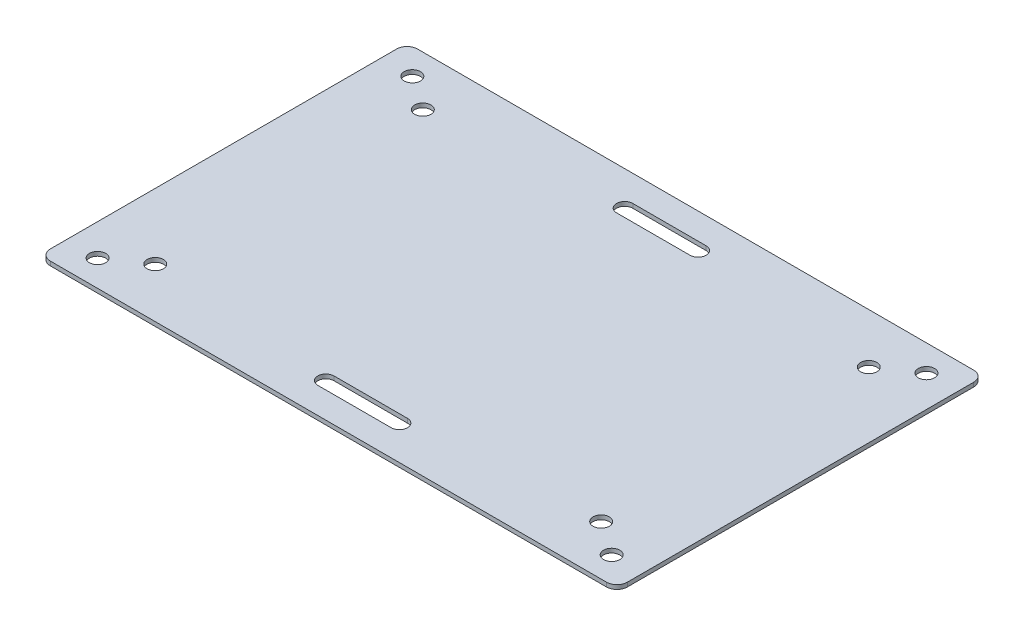
ISO-10303-21;
HEADER;
FILE_DESCRIPTION(('STEP AP214'),'2;1');
FILE_NAME('part.step','',(''),(''),'','','');
FILE_SCHEMA(('AUTOMOTIVE_DESIGN { 1 0 10303 214 1 1 1 1 }'));
ENDSEC;
DATA;
#1=APPLICATION_CONTEXT('core data for automotive mechanical design processes');
#2=APPLICATION_PROTOCOL_DEFINITION('international standard','automotive_design',2000,#1);
#3=PRODUCT_CONTEXT('',#1,'mechanical');
#4=PRODUCT('Part','Part','',(#3));
#5=PRODUCT_RELATED_PRODUCT_CATEGORY('part','',(#4));
#6=PRODUCT_DEFINITION_FORMATION('','',#4);
#7=PRODUCT_DEFINITION_CONTEXT('part definition',#1,'design');
#8=PRODUCT_DEFINITION('design','',#6,#7);
#9=PRODUCT_DEFINITION_SHAPE('','',#8);
#10=(LENGTH_UNIT() NAMED_UNIT(*) SI_UNIT(.MILLI.,.METRE.));
#11=(NAMED_UNIT(*) PLANE_ANGLE_UNIT() SI_UNIT($,.RADIAN.));
#12=(NAMED_UNIT(*) SI_UNIT($,.STERADIAN.) SOLID_ANGLE_UNIT());
#13=UNCERTAINTY_MEASURE_WITH_UNIT(LENGTH_MEASURE(1.E-05),#10,'distance_accuracy_value','');
#14=(GEOMETRIC_REPRESENTATION_CONTEXT(3) GLOBAL_UNCERTAINTY_ASSIGNED_CONTEXT((#13)) GLOBAL_UNIT_ASSIGNED_CONTEXT((#10,
#11,#12)) REPRESENTATION_CONTEXT('',''));
#15=CARTESIAN_POINT('',(0.,0.,0.));
#16=DIRECTION('',(0.,0.,1.));
#17=DIRECTION('',(1.,0.,0.));
#18=AXIS2_PLACEMENT_3D('',#15,#16,#17);
#19=CARTESIAN_POINT('',(0.,0.8,0.));
#20=DIRECTION('',(0.,1.,0.));
#21=DIRECTION('',(0.,0.,1.));
#22=AXIS2_PLACEMENT_3D('',#19,#20,#21);
#23=PLANE('',#22);
#24=CARTESIAN_POINT('',(42.5,0.8,25.5));
#25=DIRECTION('',(0.,1.,0.));
#26=DIRECTION('',(0.,0.,1.));
#27=AXIS2_PLACEMENT_3D('',#24,#25,#26);
#28=CIRCLE('',#27,1.55);
#29=CARTESIAN_POINT('',(42.5,0.8,27.05));
#30=VERTEX_POINT('',#29);
#31=EDGE_CURVE('E258',#30,#30,#28,.T.);
#32=ORIENTED_EDGE('',*,*,#31,.F.);
#33=EDGE_LOOP('',(#32));
#34=FACE_BOUND('',#33,.T.);
#35=CARTESIAN_POINT('',(-42.5,0.8,-25.5));
#36=DIRECTION('',(0.,1.,0.));
#37=DIRECTION('',(0.,0.,1.));
#38=AXIS2_PLACEMENT_3D('',#35,#36,#37);
#39=CIRCLE('',#38,1.55);
#40=CARTESIAN_POINT('',(-42.5,0.8,-23.95));
#41=VERTEX_POINT('',#40);
#42=EDGE_CURVE('E274',#41,#41,#39,.T.);
#43=ORIENTED_EDGE('',*,*,#42,.F.);
#44=EDGE_LOOP('',(#43));
#45=FACE_BOUND('',#44,.T.);
#46=CARTESIAN_POINT('',(49.,0.8,30.));
#47=DIRECTION('',(0.,1.,0.));
#48=DIRECTION('',(0.,0.,1.));
#49=AXIS2_PLACEMENT_3D('',#46,#47,#48);
#50=CIRCLE('',#49,1.55);
#51=CARTESIAN_POINT('',(49.,0.8,31.55));
#52=VERTEX_POINT('',#51);
#53=EDGE_CURVE('E290',#52,#52,#50,.T.);
#54=ORIENTED_EDGE('',*,*,#53,.F.);
#55=EDGE_LOOP('',(#54));
#56=FACE_BOUND('',#55,.T.);
#57=CARTESIAN_POINT('',(-49.,0.8,-30.));
#58=DIRECTION('',(0.,1.,0.));
#59=DIRECTION('',(0.,0.,1.));
#60=AXIS2_PLACEMENT_3D('',#57,#58,#59);
#61=CIRCLE('',#60,1.55);
#62=CARTESIAN_POINT('',(-49.,0.8,-28.45));
#63=VERTEX_POINT('',#62);
#64=EDGE_CURVE('E306',#63,#63,#61,.T.);
#65=ORIENTED_EDGE('',*,*,#64,.F.);
#66=EDGE_LOOP('',(#65));
#67=FACE_BOUND('',#66,.T.);
#68=DIRECTION('',(1.,0.,0.));
#69=VECTOR('',#68,1.);
#70=CARTESIAN_POINT('',(-55.,0.8,35.));
#71=LINE('',#70,#69);
#72=CARTESIAN_POINT('',(-53.,0.8,35.));
#73=VERTEX_POINT('',#72);
#74=CARTESIAN_POINT('',(53.,0.8,35.));
#75=VERTEX_POINT('',#74);
#76=EDGE_CURVE('E326',#73,#75,#71,.T.);
#77=ORIENTED_EDGE('',*,*,#76,.T.);
#78=CARTESIAN_POINT('',(53.,0.8,33.));
#79=DIRECTION('',(0.,1.,0.));
#80=DIRECTION('',(0.,0.,1.));
#81=AXIS2_PLACEMENT_3D('',#78,#79,#80);
#82=CIRCLE('',#81,2.);
#83=CARTESIAN_POINT('',(55.,0.8,33.));
#84=VERTEX_POINT('',#83);
#85=EDGE_CURVE('E11',#75,#84,#82,.T.);
#86=ORIENTED_EDGE('',*,*,#85,.T.);
#87=DIRECTION('',(0.,0.,-1.));
#88=VECTOR('',#87,1.);
#89=CARTESIAN_POINT('',(55.,0.8,-35.));
#90=LINE('',#89,#88);
#91=CARTESIAN_POINT('',(55.,0.8,-33.));
#92=VERTEX_POINT('',#91);
#93=EDGE_CURVE('E314',#84,#92,#90,.T.);
#94=ORIENTED_EDGE('',*,*,#93,.T.);
#95=CARTESIAN_POINT('',(53.,0.8,-33.));
#96=DIRECTION('',(0.,1.,0.));
#97=DIRECTION('',(0.,0.,1.));
#98=AXIS2_PLACEMENT_3D('',#95,#96,#97);
#99=CIRCLE('',#98,2.);
#100=CARTESIAN_POINT('',(53.,0.8,-35.));
#101=VERTEX_POINT('',#100);
#102=EDGE_CURVE('E353',#92,#101,#99,.T.);
#103=ORIENTED_EDGE('',*,*,#102,.T.);
#104=DIRECTION('',(-1.,0.,0.));
#105=VECTOR('',#104,1.);
#106=CARTESIAN_POINT('',(-55.,0.8,-35.));
#107=LINE('',#106,#105);
#108=CARTESIAN_POINT('',(-53.,0.8,-35.));
#109=VERTEX_POINT('',#108);
#110=EDGE_CURVE('E317',#101,#109,#107,.T.);
#111=ORIENTED_EDGE('',*,*,#110,.T.);
#112=CARTESIAN_POINT('',(-53.,0.8,-33.));
#113=DIRECTION('',(0.,1.,0.));
#114=DIRECTION('',(0.,0.,1.));
#115=AXIS2_PLACEMENT_3D('',#112,#113,#114);
#116=CIRCLE('',#115,2.);
#117=CARTESIAN_POINT('',(-55.,0.8,-33.));
#118=VERTEX_POINT('',#117);
#119=EDGE_CURVE('E366',#109,#118,#116,.T.);
#120=ORIENTED_EDGE('',*,*,#119,.T.);
#121=DIRECTION('',(0.,0.,1.));
#122=VECTOR('',#121,1.);
#123=CARTESIAN_POINT('',(-55.,0.8,-35.));
#124=LINE('',#123,#122);
#125=CARTESIAN_POINT('',(-55.,0.8,33.));
#126=VERTEX_POINT('',#125);
#127=EDGE_CURVE('E322',#118,#126,#124,.T.);
#128=ORIENTED_EDGE('',*,*,#127,.T.);
#129=CARTESIAN_POINT('',(-53.,0.8,33.));
#130=DIRECTION('',(0.,1.,0.));
#131=DIRECTION('',(0.,0.,1.));
#132=AXIS2_PLACEMENT_3D('',#129,#130,#131);
#133=CIRCLE('',#132,2.);
#134=EDGE_CURVE('E379',#126,#73,#133,.T.);
#135=ORIENTED_EDGE('',*,*,#134,.T.);
#136=EDGE_LOOP('',(#77,#86,#94,#103,#111,#120,#128,#135));
#137=FACE_BOUND('',#136,.T.);
#138=CARTESIAN_POINT('',(49.,0.8,-30.));
#139=DIRECTION('',(0.,1.,0.));
#140=DIRECTION('',(0.,0.,-1.));
#141=AXIS2_PLACEMENT_3D('',#138,#139,#140);
#142=CIRCLE('',#141,1.55);
#143=CARTESIAN_POINT('',(49.,0.8,-31.55));
#144=VERTEX_POINT('',#143);
#145=EDGE_CURVE('E298',#144,#144,#142,.T.);
#146=ORIENTED_EDGE('',*,*,#145,.F.);
#147=EDGE_LOOP('',(#146));
#148=FACE_BOUND('',#147,.T.);
#149=CARTESIAN_POINT('',(-49.,0.8,30.));
#150=DIRECTION('',(0.,1.,0.));
#151=DIRECTION('',(0.,0.,-1.));
#152=AXIS2_PLACEMENT_3D('',#149,#150,#151);
#153=CIRCLE('',#152,1.55);
#154=CARTESIAN_POINT('',(-49.,0.8,28.45));
#155=VERTEX_POINT('',#154);
#156=EDGE_CURVE('E282',#155,#155,#153,.T.);
#157=ORIENTED_EDGE('',*,*,#156,.F.);
#158=EDGE_LOOP('',(#157));
#159=FACE_BOUND('',#158,.T.);
#160=CARTESIAN_POINT('',(42.5,0.8,-25.5));
#161=DIRECTION('',(0.,1.,0.));
#162=DIRECTION('',(0.,0.,-1.));
#163=AXIS2_PLACEMENT_3D('',#160,#161,#162);
#164=CIRCLE('',#163,1.55);
#165=CARTESIAN_POINT('',(42.5,0.8,-27.05));
#166=VERTEX_POINT('',#165);
#167=EDGE_CURVE('E266',#166,#166,#164,.T.);
#168=ORIENTED_EDGE('',*,*,#167,.F.);
#169=EDGE_LOOP('',(#168));
#170=FACE_BOUND('',#169,.T.);
#171=CARTESIAN_POINT('',(-42.5,0.8,25.5));
#172=DIRECTION('',(0.,1.,0.));
#173=DIRECTION('',(0.,0.,-1.));
#174=AXIS2_PLACEMENT_3D('',#171,#172,#173);
#175=CIRCLE('',#174,1.55);
#176=CARTESIAN_POINT('',(-42.5,0.8,23.95));
#177=VERTEX_POINT('',#176);
#178=EDGE_CURVE('E250',#177,#177,#175,.T.);
#179=ORIENTED_EDGE('',*,*,#178,.F.);
#180=EDGE_LOOP('',(#179));
#181=FACE_BOUND('',#180,.T.);
#182=DIRECTION('',(1.,0.,0.));
#183=VECTOR('',#182,1.);
#184=CARTESIAN_POINT('',(7.,0.8,-26.9233502741413));
#185=LINE('',#184,#183);
#186=CARTESIAN_POINT('',(-7.,0.8,-26.9233502741413));
#187=VERTEX_POINT('',#186);
#188=CARTESIAN_POINT('',(7.,0.8,-26.9233502741413));
#189=VERTEX_POINT('',#188);
#190=EDGE_CURVE('E210',#187,#189,#185,.T.);
#191=ORIENTED_EDGE('',*,*,#190,.F.);
#192=CARTESIAN_POINT('',(-7.,0.8,-28.4733502741413));
#193=DIRECTION('',(0.,1.,0.));
#194=DIRECTION('',(0.,0.,-1.));
#195=AXIS2_PLACEMENT_3D('',#192,#193,#194);
#196=CIRCLE('',#195,1.55);
#197=CARTESIAN_POINT('',(-7.,0.8,-30.0233502741413));
#198=VERTEX_POINT('',#197);
#199=EDGE_CURVE('E207',#198,#187,#196,.T.);
#200=ORIENTED_EDGE('',*,*,#199,.F.);
#201=DIRECTION('',(-1.,0.,0.));
#202=VECTOR('',#201,1.);
#203=CARTESIAN_POINT('',(-7.,0.8,-30.0233502741413));
#204=LINE('',#203,#202);
#205=CARTESIAN_POINT('',(7.,0.8,-30.0233502741413));
#206=VERTEX_POINT('',#205);
#207=EDGE_CURVE('E218',#206,#198,#204,.T.);
#208=ORIENTED_EDGE('',*,*,#207,.F.);
#209=CARTESIAN_POINT('',(7.,0.8,-28.4733502741413));
#210=DIRECTION('',(0.,1.,0.));
#211=DIRECTION('',(0.,0.,1.));
#212=AXIS2_PLACEMENT_3D('',#209,#210,#211);
#213=CIRCLE('',#212,1.55);
#214=EDGE_CURVE('E214',#189,#206,#213,.T.);
#215=ORIENTED_EDGE('',*,*,#214,.F.);
#216=EDGE_LOOP('',(#191,#200,#208,#215));
#217=FACE_BOUND('',#216,.T.);
#218=DIRECTION('',(-1.,0.,0.));
#219=VECTOR('',#218,1.);
#220=CARTESIAN_POINT('',(7.,0.8,26.9233502741413));
#221=LINE('',#220,#219);
#222=CARTESIAN_POINT('',(7.,0.8,26.9233502741413));
#223=VERTEX_POINT('',#222);
#224=CARTESIAN_POINT('',(-7.,0.8,26.9233502741413));
#225=VERTEX_POINT('',#224);
#226=EDGE_CURVE('E165',#223,#225,#221,.T.);
#227=ORIENTED_EDGE('',*,*,#226,.F.);
#228=CARTESIAN_POINT('',(7.,0.8,28.4733502741413));
#229=DIRECTION('',(0.,1.,0.));
#230=DIRECTION('',(0.,0.,-1.));
#231=AXIS2_PLACEMENT_3D('',#228,#229,#230);
#232=CIRCLE('',#231,1.55);
#233=CARTESIAN_POINT('',(7.,0.8,30.0233502741413));
#234=VERTEX_POINT('',#233);
#235=EDGE_CURVE('E154',#234,#223,#232,.T.);
#236=ORIENTED_EDGE('',*,*,#235,.F.);
#237=DIRECTION('',(1.,0.,0.));
#238=VECTOR('',#237,1.);
#239=CARTESIAN_POINT('',(-7.,0.8,30.0233502741413));
#240=LINE('',#239,#238);
#241=CARTESIAN_POINT('',(-7.,0.8,30.0233502741413));
#242=VERTEX_POINT('',#241);
#243=EDGE_CURVE('E183',#242,#234,#240,.T.);
#244=ORIENTED_EDGE('',*,*,#243,.F.);
#245=CARTESIAN_POINT('',(-7.,0.8,28.4733502741413));
#246=DIRECTION('',(0.,1.,0.));
#247=DIRECTION('',(0.,0.,1.));
#248=AXIS2_PLACEMENT_3D('',#245,#246,#247);
#249=CIRCLE('',#248,1.55);
#250=EDGE_CURVE('E179',#225,#242,#249,.T.);
#251=ORIENTED_EDGE('',*,*,#250,.F.);
#252=EDGE_LOOP('',(#227,#236,#244,#251));
#253=FACE_BOUND('',#252,.T.);
#254=ADVANCED_FACE('F39',(#34,#45,#56,#67,#137,#148,#159,#170,#181,#217,#253),#23,.T.);
#255=CARTESIAN_POINT('',(0.,0.,0.));
#256=DIRECTION('',(0.,1.,0.));
#257=DIRECTION('',(0.,0.,1.));
#258=AXIS2_PLACEMENT_3D('',#255,#256,#257);
#259=PLANE('',#258);
#260=CARTESIAN_POINT('',(-7.,0.,-28.4733502741413));
#261=DIRECTION('',(0.,1.,0.));
#262=DIRECTION('',(0.,0.,-1.));
#263=AXIS2_PLACEMENT_3D('',#260,#261,#262);
#264=CIRCLE('',#263,1.55);
#265=CARTESIAN_POINT('',(-7.,0.,-30.0233502741413));
#266=VERTEX_POINT('',#265);
#267=CARTESIAN_POINT('',(-7.,0.,-26.9233502741413));
#268=VERTEX_POINT('',#267);
#269=EDGE_CURVE('E174',#266,#268,#264,.T.);
#270=ORIENTED_EDGE('',*,*,#269,.T.);
#271=DIRECTION('',(1.,0.,0.));
#272=VECTOR('',#271,1.);
#273=CARTESIAN_POINT('',(7.,0.,-26.9233502741413));
#274=LINE('',#273,#272);
#275=CARTESIAN_POINT('',(7.,0.,-26.9233502741413));
#276=VERTEX_POINT('',#275);
#277=EDGE_CURVE('E225',#268,#276,#274,.T.);
#278=ORIENTED_EDGE('',*,*,#277,.T.);
#279=CARTESIAN_POINT('',(7.,0.,-28.4733502741413));
#280=DIRECTION('',(0.,1.,0.));
#281=DIRECTION('',(0.,0.,1.));
#282=AXIS2_PLACEMENT_3D('',#279,#280,#281);
#283=CIRCLE('',#282,1.55);
#284=CARTESIAN_POINT('',(7.,0.,-30.0233502741413));
#285=VERTEX_POINT('',#284);
#286=EDGE_CURVE('E229',#276,#285,#283,.T.);
#287=ORIENTED_EDGE('',*,*,#286,.T.);
#288=DIRECTION('',(-1.,0.,0.));
#289=VECTOR('',#288,1.);
#290=CARTESIAN_POINT('',(-7.,0.,-30.0233502741413));
#291=LINE('',#290,#289);
#292=EDGE_CURVE('E211',#285,#266,#291,.T.);
#293=ORIENTED_EDGE('',*,*,#292,.T.);
#294=EDGE_LOOP('',(#270,#278,#287,#293));
#295=FACE_BOUND('',#294,.T.);
#296=DIRECTION('',(0.,0.,-1.));
#297=VECTOR('',#296,1.);
#298=CARTESIAN_POINT('',(55.,0.,-35.));
#299=LINE('',#298,#297);
#300=CARTESIAN_POINT('',(55.,0.,33.));
#301=VERTEX_POINT('',#300);
#302=CARTESIAN_POINT('',(55.,0.,-33.));
#303=VERTEX_POINT('',#302);
#304=EDGE_CURVE('E310',#301,#303,#299,.T.);
#305=ORIENTED_EDGE('',*,*,#304,.F.);
#306=CARTESIAN_POINT('',(53.,0.,33.));
#307=DIRECTION('',(0.,1.,0.));
#308=DIRECTION('',(0.,0.,1.));
#309=AXIS2_PLACEMENT_3D('',#306,#307,#308);
#310=CIRCLE('',#309,2.);
#311=CARTESIAN_POINT('',(53.,0.,35.));
#312=VERTEX_POINT('',#311);
#313=EDGE_CURVE('E62',#301,#312,#310,.F.);
#314=ORIENTED_EDGE('',*,*,#313,.T.);
#315=DIRECTION('',(1.,0.,0.));
#316=VECTOR('',#315,1.);
#317=CARTESIAN_POINT('',(-55.,0.,35.));
#318=LINE('',#317,#316);
#319=CARTESIAN_POINT('',(-53.,0.,35.));
#320=VERTEX_POINT('',#319);
#321=EDGE_CURVE('E318',#320,#312,#318,.T.);
#322=ORIENTED_EDGE('',*,*,#321,.F.);
#323=CARTESIAN_POINT('',(-53.,0.,33.));
#324=DIRECTION('',(0.,1.,0.));
#325=DIRECTION('',(0.,0.,1.));
#326=AXIS2_PLACEMENT_3D('',#323,#324,#325);
#327=CIRCLE('',#326,2.);
#328=CARTESIAN_POINT('',(-55.,0.,33.));
#329=VERTEX_POINT('',#328);
#330=EDGE_CURVE('E373',#320,#329,#327,.F.);
#331=ORIENTED_EDGE('',*,*,#330,.T.);
#332=DIRECTION('',(0.,0.,1.));
#333=VECTOR('',#332,1.);
#334=CARTESIAN_POINT('',(-55.,0.,-35.));
#335=LINE('',#334,#333);
#336=CARTESIAN_POINT('',(-55.,0.,-33.));
#337=VERTEX_POINT('',#336);
#338=EDGE_CURVE('E336',#337,#329,#335,.T.);
#339=ORIENTED_EDGE('',*,*,#338,.F.);
#340=CARTESIAN_POINT('',(-53.,0.,-33.));
#341=DIRECTION('',(0.,1.,0.));
#342=DIRECTION('',(0.,0.,1.));
#343=AXIS2_PLACEMENT_3D('',#340,#341,#342);
#344=CIRCLE('',#343,2.);
#345=CARTESIAN_POINT('',(-53.,0.,-35.));
#346=VERTEX_POINT('',#345);
#347=EDGE_CURVE('E360',#337,#346,#344,.F.);
#348=ORIENTED_EDGE('',*,*,#347,.T.);
#349=DIRECTION('',(-1.,0.,0.));
#350=VECTOR('',#349,1.);
#351=CARTESIAN_POINT('',(-55.,0.,-35.));
#352=LINE('',#351,#350);
#353=CARTESIAN_POINT('',(53.,0.,-35.));
#354=VERTEX_POINT('',#353);
#355=EDGE_CURVE('E332',#354,#346,#352,.T.);
#356=ORIENTED_EDGE('',*,*,#355,.F.);
#357=CARTESIAN_POINT('',(53.,0.,-33.));
#358=DIRECTION('',(0.,1.,0.));
#359=DIRECTION('',(0.,0.,1.));
#360=AXIS2_PLACEMENT_3D('',#357,#358,#359);
#361=CIRCLE('',#360,2.);
#362=EDGE_CURVE('E345',#354,#303,#361,.F.);
#363=ORIENTED_EDGE('',*,*,#362,.T.);
#364=EDGE_LOOP('',(#305,#314,#322,#331,#339,#348,#356,#363));
#365=FACE_BOUND('',#364,.T.);
#366=CARTESIAN_POINT('',(-49.,0.,-30.));
#367=DIRECTION('',(0.,1.,0.));
#368=DIRECTION('',(0.,0.,1.));
#369=AXIS2_PLACEMENT_3D('',#366,#367,#368);
#370=CIRCLE('',#369,1.55);
#371=CARTESIAN_POINT('',(-49.,0.,-28.45));
#372=VERTEX_POINT('',#371);
#373=EDGE_CURVE('E302',#372,#372,#370,.T.);
#374=ORIENTED_EDGE('',*,*,#373,.T.);
#375=EDGE_LOOP('',(#374));
#376=FACE_BOUND('',#375,.T.);
#377=CARTESIAN_POINT('',(49.,0.,-30.));
#378=DIRECTION('',(0.,1.,0.));
#379=DIRECTION('',(0.,0.,-1.));
#380=AXIS2_PLACEMENT_3D('',#377,#378,#379);
#381=CIRCLE('',#380,1.55);
#382=CARTESIAN_POINT('',(49.,0.,-31.55));
#383=VERTEX_POINT('',#382);
#384=EDGE_CURVE('E294',#383,#383,#381,.T.);
#385=ORIENTED_EDGE('',*,*,#384,.T.);
#386=EDGE_LOOP('',(#385));
#387=FACE_BOUND('',#386,.T.);
#388=CARTESIAN_POINT('',(49.,0.,30.));
#389=DIRECTION('',(0.,1.,0.));
#390=DIRECTION('',(0.,0.,1.));
#391=AXIS2_PLACEMENT_3D('',#388,#389,#390);
#392=CIRCLE('',#391,1.55);
#393=CARTESIAN_POINT('',(49.,0.,31.55));
#394=VERTEX_POINT('',#393);
#395=EDGE_CURVE('E286',#394,#394,#392,.T.);
#396=ORIENTED_EDGE('',*,*,#395,.T.);
#397=EDGE_LOOP('',(#396));
#398=FACE_BOUND('',#397,.T.);
#399=CARTESIAN_POINT('',(-49.,0.,30.));
#400=DIRECTION('',(0.,1.,0.));
#401=DIRECTION('',(0.,0.,-1.));
#402=AXIS2_PLACEMENT_3D('',#399,#400,#401);
#403=CIRCLE('',#402,1.55);
#404=CARTESIAN_POINT('',(-49.,0.,28.45));
#405=VERTEX_POINT('',#404);
#406=EDGE_CURVE('E278',#405,#405,#403,.T.);
#407=ORIENTED_EDGE('',*,*,#406,.T.);
#408=EDGE_LOOP('',(#407));
#409=FACE_BOUND('',#408,.T.);
#410=CARTESIAN_POINT('',(-42.5,0.,-25.5));
#411=DIRECTION('',(0.,1.,0.));
#412=DIRECTION('',(0.,0.,1.));
#413=AXIS2_PLACEMENT_3D('',#410,#411,#412);
#414=CIRCLE('',#413,1.55);
#415=CARTESIAN_POINT('',(-42.5,0.,-23.95));
#416=VERTEX_POINT('',#415);
#417=EDGE_CURVE('E270',#416,#416,#414,.T.);
#418=ORIENTED_EDGE('',*,*,#417,.T.);
#419=EDGE_LOOP('',(#418));
#420=FACE_BOUND('',#419,.T.);
#421=CARTESIAN_POINT('',(42.5,0.,-25.5));
#422=DIRECTION('',(0.,1.,0.));
#423=DIRECTION('',(0.,0.,-1.));
#424=AXIS2_PLACEMENT_3D('',#421,#422,#423);
#425=CIRCLE('',#424,1.55);
#426=CARTESIAN_POINT('',(42.5,0.,-27.05));
#427=VERTEX_POINT('',#426);
#428=EDGE_CURVE('E262',#427,#427,#425,.T.);
#429=ORIENTED_EDGE('',*,*,#428,.T.);
#430=EDGE_LOOP('',(#429));
#431=FACE_BOUND('',#430,.T.);
#432=CARTESIAN_POINT('',(42.5,0.,25.5));
#433=DIRECTION('',(0.,1.,0.));
#434=DIRECTION('',(0.,0.,1.));
#435=AXIS2_PLACEMENT_3D('',#432,#433,#434);
#436=CIRCLE('',#435,1.55);
#437=CARTESIAN_POINT('',(42.5,0.,27.05));
#438=VERTEX_POINT('',#437);
#439=EDGE_CURVE('E254',#438,#438,#436,.T.);
#440=ORIENTED_EDGE('',*,*,#439,.T.);
#441=EDGE_LOOP('',(#440));
#442=FACE_BOUND('',#441,.T.);
#443=CARTESIAN_POINT('',(-42.5,0.,25.5));
#444=DIRECTION('',(0.,1.,0.));
#445=DIRECTION('',(0.,0.,-1.));
#446=AXIS2_PLACEMENT_3D('',#443,#444,#445);
#447=CIRCLE('',#446,1.55);
#448=CARTESIAN_POINT('',(-42.5,0.,23.95));
#449=VERTEX_POINT('',#448);
#450=EDGE_CURVE('E249',#449,#449,#447,.T.);
#451=ORIENTED_EDGE('',*,*,#450,.T.);
#452=EDGE_LOOP('',(#451));
#453=FACE_BOUND('',#452,.T.);
#454=CARTESIAN_POINT('',(7.,0.,28.4733502741413));
#455=DIRECTION('',(0.,1.,0.));
#456=DIRECTION('',(0.,0.,-1.));
#457=AXIS2_PLACEMENT_3D('',#454,#455,#456);
#458=CIRCLE('',#457,1.55);
#459=CARTESIAN_POINT('',(7.,0.,30.0233502741413));
#460=VERTEX_POINT('',#459);
#461=CARTESIAN_POINT('',(7.,0.,26.9233502741413));
#462=VERTEX_POINT('',#461);
#463=EDGE_CURVE('E188',#460,#462,#458,.T.);
#464=ORIENTED_EDGE('',*,*,#463,.T.);
#465=DIRECTION('',(-1.,0.,0.));
#466=VECTOR('',#465,1.);
#467=CARTESIAN_POINT('',(7.,0.,26.9233502741413));
#468=LINE('',#467,#466);
#469=CARTESIAN_POINT('',(-7.,0.,26.9233502741413));
#470=VERTEX_POINT('',#469);
#471=EDGE_CURVE('E172',#462,#470,#468,.T.);
#472=ORIENTED_EDGE('',*,*,#471,.T.);
#473=CARTESIAN_POINT('',(-7.,0.,28.4733502741413));
#474=DIRECTION('',(0.,1.,0.));
#475=DIRECTION('',(0.,0.,1.));
#476=AXIS2_PLACEMENT_3D('',#473,#474,#475);
#477=CIRCLE('',#476,1.55);
#478=CARTESIAN_POINT('',(-7.,0.,30.0233502741413));
#479=VERTEX_POINT('',#478);
#480=EDGE_CURVE('E193',#470,#479,#477,.T.);
#481=ORIENTED_EDGE('',*,*,#480,.T.);
#482=DIRECTION('',(1.,0.,0.));
#483=VECTOR('',#482,1.);
#484=CARTESIAN_POINT('',(-7.,0.,30.0233502741413));
#485=LINE('',#484,#483);
#486=EDGE_CURVE('E166',#479,#460,#485,.T.);
#487=ORIENTED_EDGE('',*,*,#486,.T.);
#488=EDGE_LOOP('',(#464,#472,#481,#487));
#489=FACE_BOUND('',#488,.T.);
#490=ADVANCED_FACE('F394',(#295,#365,#376,#387,#398,#409,#420,#431,#442,#453,#489),#259,.F.);
#491=CARTESIAN_POINT('',(55.,0.8,-35.));
#492=DIRECTION('',(-1.,0.,0.));
#493=DIRECTION('',(0.,0.,1.));
#494=AXIS2_PLACEMENT_3D('',#491,#492,#493);
#495=PLANE('',#494);
#496=ORIENTED_EDGE('',*,*,#93,.F.);
#497=DIRECTION('',(0.,-1.,0.));
#498=VECTOR('',#497,1.);
#499=CARTESIAN_POINT('',(55.,0.8,33.));
#500=LINE('',#499,#498);
#501=EDGE_CURVE('E382',#84,#301,#500,.T.);
#502=ORIENTED_EDGE('',*,*,#501,.T.);
#503=ORIENTED_EDGE('',*,*,#304,.T.);
#504=DIRECTION('',(0.,-1.,0.));
#505=VECTOR('',#504,1.);
#506=CARTESIAN_POINT('',(55.,0.8,-33.));
#507=LINE('',#506,#505);
#508=EDGE_CURVE('E349',#303,#92,#507,.F.);
#509=ORIENTED_EDGE('',*,*,#508,.T.);
#510=EDGE_LOOP('',(#496,#502,#503,#509));
#511=FACE_BOUND('',#510,.T.);
#512=ADVANCED_FACE('F391',(#511),#495,.F.);
#513=CARTESIAN_POINT('',(-55.,0.8,-35.));
#514=DIRECTION('',(0.,0.,1.));
#515=DIRECTION('',(1.,0.,0.));
#516=AXIS2_PLACEMENT_3D('',#513,#514,#515);
#517=PLANE('',#516);
#518=ORIENTED_EDGE('',*,*,#355,.T.);
#519=DIRECTION('',(0.,-1.,0.));
#520=VECTOR('',#519,1.);
#521=CARTESIAN_POINT('',(-53.,0.8,-35.));
#522=LINE('',#521,#520);
#523=EDGE_CURVE('E363',#346,#109,#522,.F.);
#524=ORIENTED_EDGE('',*,*,#523,.T.);
#525=ORIENTED_EDGE('',*,*,#110,.F.);
#526=DIRECTION('',(0.,-1.,0.));
#527=VECTOR('',#526,1.);
#528=CARTESIAN_POINT('',(53.,0.8,-35.));
#529=LINE('',#528,#527);
#530=EDGE_CURVE('E329',#101,#354,#529,.T.);
#531=ORIENTED_EDGE('',*,*,#530,.T.);
#532=EDGE_LOOP('',(#518,#524,#525,#531));
#533=FACE_BOUND('',#532,.T.);
#534=ADVANCED_FACE('F407',(#533),#517,.F.);
#535=CARTESIAN_POINT('',(-55.,0.8,-35.));
#536=DIRECTION('',(1.,0.,0.));
#537=DIRECTION('',(0.,0.,-1.));
#538=AXIS2_PLACEMENT_3D('',#535,#536,#537);
#539=PLANE('',#538);
#540=ORIENTED_EDGE('',*,*,#338,.T.);
#541=DIRECTION('',(0.,-1.,0.));
#542=VECTOR('',#541,1.);
#543=CARTESIAN_POINT('',(-55.,0.8,33.));
#544=LINE('',#543,#542);
#545=EDGE_CURVE('E376',#329,#126,#544,.F.);
#546=ORIENTED_EDGE('',*,*,#545,.T.);
#547=ORIENTED_EDGE('',*,*,#127,.F.);
#548=DIRECTION('',(0.,-1.,0.));
#549=VECTOR('',#548,1.);
#550=CARTESIAN_POINT('',(-55.,0.8,-33.));
#551=LINE('',#550,#549);
#552=EDGE_CURVE('E356',#118,#337,#551,.T.);
#553=ORIENTED_EDGE('',*,*,#552,.T.);
#554=EDGE_LOOP('',(#540,#546,#547,#553));
#555=FACE_BOUND('',#554,.T.);
#556=ADVANCED_FACE('F415',(#555),#539,.F.);
#557=CARTESIAN_POINT('',(-55.,0.8,35.));
#558=DIRECTION('',(0.,0.,-1.));
#559=DIRECTION('',(-1.,0.,0.));
#560=AXIS2_PLACEMENT_3D('',#557,#558,#559);
#561=PLANE('',#560);
#562=ORIENTED_EDGE('',*,*,#321,.T.);
#563=DIRECTION('',(0.,-1.,0.));
#564=VECTOR('',#563,1.);
#565=CARTESIAN_POINT('',(53.,0.8,35.));
#566=LINE('',#565,#564);
#567=EDGE_CURVE('E48',#312,#75,#566,.F.);
#568=ORIENTED_EDGE('',*,*,#567,.T.);
#569=ORIENTED_EDGE('',*,*,#76,.F.);
#570=DIRECTION('',(0.,-1.,0.));
#571=VECTOR('',#570,1.);
#572=CARTESIAN_POINT('',(-53.,0.8,35.));
#573=LINE('',#572,#571);
#574=EDGE_CURVE('E369',#73,#320,#573,.T.);
#575=ORIENTED_EDGE('',*,*,#574,.T.);
#576=EDGE_LOOP('',(#562,#568,#569,#575));
#577=FACE_BOUND('',#576,.T.);
#578=ADVANCED_FACE('F421',(#577),#561,.F.);
#579=CARTESIAN_POINT('',(-49.,0.8,-30.));
#580=DIRECTION('',(0.,-1.,0.));
#581=DIRECTION('',(0.,0.,-1.));
#582=AXIS2_PLACEMENT_3D('',#579,#580,#581);
#583=CYLINDRICAL_SURFACE('',#582,1.55);
#584=ORIENTED_EDGE('',*,*,#64,.T.);
#585=EDGE_LOOP('',(#584));
#586=FACE_BOUND('',#585,.T.);
#587=ORIENTED_EDGE('',*,*,#373,.F.);
#588=EDGE_LOOP('',(#587));
#589=FACE_BOUND('',#588,.T.);
#590=ADVANCED_FACE('F437',(#586,#589),#583,.F.);
#591=CARTESIAN_POINT('',(49.,0.8,-30.));
#592=DIRECTION('',(0.,-1.,0.));
#593=DIRECTION('',(0.,0.,-1.));
#594=AXIS2_PLACEMENT_3D('',#591,#592,#593);
#595=CYLINDRICAL_SURFACE('',#594,1.55);
#596=ORIENTED_EDGE('',*,*,#145,.T.);
#597=EDGE_LOOP('',(#596));
#598=FACE_BOUND('',#597,.T.);
#599=ORIENTED_EDGE('',*,*,#384,.F.);
#600=EDGE_LOOP('',(#599));
#601=FACE_BOUND('',#600,.T.);
#602=ADVANCED_FACE('F502',(#598,#601),#595,.F.);
#603=CARTESIAN_POINT('',(49.,0.8,30.));
#604=DIRECTION('',(0.,-1.,0.));
#605=DIRECTION('',(0.,0.,-1.));
#606=AXIS2_PLACEMENT_3D('',#603,#604,#605);
#607=CYLINDRICAL_SURFACE('',#606,1.55);
#608=ORIENTED_EDGE('',*,*,#53,.T.);
#609=EDGE_LOOP('',(#608));
#610=FACE_BOUND('',#609,.T.);
#611=ORIENTED_EDGE('',*,*,#395,.F.);
#612=EDGE_LOOP('',(#611));
#613=FACE_BOUND('',#612,.T.);
#614=ADVANCED_FACE('F508',(#610,#613),#607,.F.);
#615=CARTESIAN_POINT('',(-49.,0.8,30.));
#616=DIRECTION('',(0.,-1.,0.));
#617=DIRECTION('',(0.,0.,-1.));
#618=AXIS2_PLACEMENT_3D('',#615,#616,#617);
#619=CYLINDRICAL_SURFACE('',#618,1.55);
#620=ORIENTED_EDGE('',*,*,#156,.T.);
#621=EDGE_LOOP('',(#620));
#622=FACE_BOUND('',#621,.T.);
#623=ORIENTED_EDGE('',*,*,#406,.F.);
#624=EDGE_LOOP('',(#623));
#625=FACE_BOUND('',#624,.T.);
#626=ADVANCED_FACE('F515',(#622,#625),#619,.F.);
#627=CARTESIAN_POINT('',(-42.5,0.8,-25.5));
#628=DIRECTION('',(0.,-1.,0.));
#629=DIRECTION('',(0.,0.,-1.));
#630=AXIS2_PLACEMENT_3D('',#627,#628,#629);
#631=CYLINDRICAL_SURFACE('',#630,1.55);
#632=ORIENTED_EDGE('',*,*,#42,.T.);
#633=EDGE_LOOP('',(#632));
#634=FACE_BOUND('',#633,.T.);
#635=ORIENTED_EDGE('',*,*,#417,.F.);
#636=EDGE_LOOP('',(#635));
#637=FACE_BOUND('',#636,.T.);
#638=ADVANCED_FACE('F523',(#634,#637),#631,.F.);
#639=CARTESIAN_POINT('',(42.5,0.8,-25.5));
#640=DIRECTION('',(0.,-1.,0.));
#641=DIRECTION('',(0.,0.,-1.));
#642=AXIS2_PLACEMENT_3D('',#639,#640,#641);
#643=CYLINDRICAL_SURFACE('',#642,1.55);
#644=ORIENTED_EDGE('',*,*,#167,.T.);
#645=EDGE_LOOP('',(#644));
#646=FACE_BOUND('',#645,.T.);
#647=ORIENTED_EDGE('',*,*,#428,.F.);
#648=EDGE_LOOP('',(#647));
#649=FACE_BOUND('',#648,.T.);
#650=ADVANCED_FACE('F531',(#646,#649),#643,.F.);
#651=CARTESIAN_POINT('',(42.5,0.8,25.5));
#652=DIRECTION('',(0.,-1.,0.));
#653=DIRECTION('',(0.,0.,-1.));
#654=AXIS2_PLACEMENT_3D('',#651,#652,#653);
#655=CYLINDRICAL_SURFACE('',#654,1.55);
#656=ORIENTED_EDGE('',*,*,#31,.T.);
#657=EDGE_LOOP('',(#656));
#658=FACE_BOUND('',#657,.T.);
#659=ORIENTED_EDGE('',*,*,#439,.F.);
#660=EDGE_LOOP('',(#659));
#661=FACE_BOUND('',#660,.T.);
#662=ADVANCED_FACE('F539',(#658,#661),#655,.F.);
#663=CARTESIAN_POINT('',(-42.5,0.8,25.5));
#664=DIRECTION('',(0.,-1.,0.));
#665=DIRECTION('',(0.,0.,-1.));
#666=AXIS2_PLACEMENT_3D('',#663,#664,#665);
#667=CYLINDRICAL_SURFACE('',#666,1.55);
#668=ORIENTED_EDGE('',*,*,#178,.T.);
#669=EDGE_LOOP('',(#668));
#670=FACE_BOUND('',#669,.T.);
#671=ORIENTED_EDGE('',*,*,#450,.F.);
#672=EDGE_LOOP('',(#671));
#673=FACE_BOUND('',#672,.T.);
#674=ADVANCED_FACE('F547',(#670,#673),#667,.F.);
#675=CARTESIAN_POINT('',(-7.,0.8,-28.4733502741413));
#676=DIRECTION('',(0.,-1.,0.));
#677=DIRECTION('',(0.,0.,-1.));
#678=AXIS2_PLACEMENT_3D('',#675,#676,#677);
#679=CYLINDRICAL_SURFACE('',#678,1.55);
#680=ORIENTED_EDGE('',*,*,#269,.F.);
#681=DIRECTION('',(0.,-1.,0.));
#682=VECTOR('',#681,1.);
#683=CARTESIAN_POINT('',(-7.,0.8,-30.0233502741413));
#684=LINE('',#683,#682);
#685=EDGE_CURVE('E221',#198,#266,#684,.T.);
#686=ORIENTED_EDGE('',*,*,#685,.F.);
#687=ORIENTED_EDGE('',*,*,#199,.T.);
#688=DIRECTION('',(0.,-1.,0.));
#689=VECTOR('',#688,1.);
#690=CARTESIAN_POINT('',(-7.,0.8,-26.9233502741413));
#691=LINE('',#690,#689);
#692=EDGE_CURVE('E245',#187,#268,#691,.T.);
#693=ORIENTED_EDGE('',*,*,#692,.T.);
#694=EDGE_LOOP('',(#680,#686,#687,#693));
#695=FACE_BOUND('',#694,.T.);
#696=ADVANCED_FACE('F555',(#695),#679,.F.);
#697=CARTESIAN_POINT('',(7.,0.8,-26.9233502741413));
#698=DIRECTION('',(0.,0.,-1.));
#699=DIRECTION('',(-1.,0.,0.));
#700=AXIS2_PLACEMENT_3D('',#697,#698,#699);
#701=PLANE('',#700);
#702=ORIENTED_EDGE('',*,*,#277,.F.);
#703=ORIENTED_EDGE('',*,*,#692,.F.);
#704=ORIENTED_EDGE('',*,*,#190,.T.);
#705=DIRECTION('',(0.,-1.,0.));
#706=VECTOR('',#705,1.);
#707=CARTESIAN_POINT('',(7.,0.8,-26.9233502741413));
#708=LINE('',#707,#706);
#709=EDGE_CURVE('E242',#189,#276,#708,.T.);
#710=ORIENTED_EDGE('',*,*,#709,.T.);
#711=EDGE_LOOP('',(#702,#703,#704,#710));
#712=FACE_BOUND('',#711,.T.);
#713=ADVANCED_FACE('F563',(#712),#701,.T.);
#714=CARTESIAN_POINT('',(7.,0.8,-28.4733502741413));
#715=DIRECTION('',(0.,-1.,0.));
#716=DIRECTION('',(0.,0.,-1.));
#717=AXIS2_PLACEMENT_3D('',#714,#715,#716);
#718=CYLINDRICAL_SURFACE('',#717,1.55);
#719=ORIENTED_EDGE('',*,*,#286,.F.);
#720=ORIENTED_EDGE('',*,*,#709,.F.);
#721=ORIENTED_EDGE('',*,*,#214,.T.);
#722=DIRECTION('',(0.,-1.,0.));
#723=VECTOR('',#722,1.);
#724=CARTESIAN_POINT('',(7.,0.8,-30.0233502741413));
#725=LINE('',#724,#723);
#726=EDGE_CURVE('E239',#206,#285,#725,.T.);
#727=ORIENTED_EDGE('',*,*,#726,.T.);
#728=EDGE_LOOP('',(#719,#720,#721,#727));
#729=FACE_BOUND('',#728,.T.);
#730=ADVANCED_FACE('F571',(#729),#718,.F.);
#731=CARTESIAN_POINT('',(-7.,0.8,-30.0233502741413));
#732=DIRECTION('',(0.,0.,1.));
#733=DIRECTION('',(1.,0.,0.));
#734=AXIS2_PLACEMENT_3D('',#731,#732,#733);
#735=PLANE('',#734);
#736=ORIENTED_EDGE('',*,*,#292,.F.);
#737=ORIENTED_EDGE('',*,*,#726,.F.);
#738=ORIENTED_EDGE('',*,*,#207,.T.);
#739=ORIENTED_EDGE('',*,*,#685,.T.);
#740=EDGE_LOOP('',(#736,#737,#738,#739));
#741=FACE_BOUND('',#740,.T.);
#742=ADVANCED_FACE('F579',(#741),#735,.T.);
#743=CARTESIAN_POINT('',(7.,0.8,28.4733502741413));
#744=DIRECTION('',(0.,-1.,0.));
#745=DIRECTION('',(0.,0.,-1.));
#746=AXIS2_PLACEMENT_3D('',#743,#744,#745);
#747=CYLINDRICAL_SURFACE('',#746,1.55);
#748=ORIENTED_EDGE('',*,*,#463,.F.);
#749=DIRECTION('',(0.,-1.,0.));
#750=VECTOR('',#749,1.);
#751=CARTESIAN_POINT('',(7.,0.8,30.0233502741413));
#752=LINE('',#751,#750);
#753=EDGE_CURVE('E160',#234,#460,#752,.T.);
#754=ORIENTED_EDGE('',*,*,#753,.F.);
#755=ORIENTED_EDGE('',*,*,#235,.T.);
#756=DIRECTION('',(0.,-1.,0.));
#757=VECTOR('',#756,1.);
#758=CARTESIAN_POINT('',(7.,0.8,26.9233502741413));
#759=LINE('',#758,#757);
#760=EDGE_CURVE('E157',#223,#462,#759,.T.);
#761=ORIENTED_EDGE('',*,*,#760,.T.);
#762=EDGE_LOOP('',(#748,#754,#755,#761));
#763=FACE_BOUND('',#762,.T.);
#764=ADVANCED_FACE('F156',(#763),#747,.F.);
#765=CARTESIAN_POINT('',(7.,0.8,26.9233502741413));
#766=DIRECTION('',(0.,0.,1.));
#767=DIRECTION('',(1.,0.,0.));
#768=AXIS2_PLACEMENT_3D('',#765,#766,#767);
#769=PLANE('',#768);
#770=ORIENTED_EDGE('',*,*,#471,.F.);
#771=ORIENTED_EDGE('',*,*,#760,.F.);
#772=ORIENTED_EDGE('',*,*,#226,.T.);
#773=DIRECTION('',(0.,-1.,0.));
#774=VECTOR('',#773,1.);
#775=CARTESIAN_POINT('',(-7.,0.8,26.9233502741413));
#776=LINE('',#775,#774);
#777=EDGE_CURVE('E175',#225,#470,#776,.T.);
#778=ORIENTED_EDGE('',*,*,#777,.T.);
#779=EDGE_LOOP('',(#770,#771,#772,#778));
#780=FACE_BOUND('',#779,.T.);
#781=ADVANCED_FACE('F169',(#780),#769,.T.);
#782=CARTESIAN_POINT('',(-7.,0.8,28.4733502741413));
#783=DIRECTION('',(0.,-1.,0.));
#784=DIRECTION('',(0.,0.,-1.));
#785=AXIS2_PLACEMENT_3D('',#782,#783,#784);
#786=CYLINDRICAL_SURFACE('',#785,1.55);
#787=ORIENTED_EDGE('',*,*,#480,.F.);
#788=ORIENTED_EDGE('',*,*,#777,.F.);
#789=ORIENTED_EDGE('',*,*,#250,.T.);
#790=DIRECTION('',(0.,-1.,0.));
#791=VECTOR('',#790,1.);
#792=CARTESIAN_POINT('',(-7.,0.8,30.0233502741413));
#793=LINE('',#792,#791);
#794=EDGE_CURVE('E202',#242,#479,#793,.T.);
#795=ORIENTED_EDGE('',*,*,#794,.T.);
#796=EDGE_LOOP('',(#787,#788,#789,#795));
#797=FACE_BOUND('',#796,.T.);
#798=ADVANCED_FACE('F600',(#797),#786,.F.);
#799=CARTESIAN_POINT('',(-7.,0.8,30.0233502741413));
#800=DIRECTION('',(0.,0.,-1.));
#801=DIRECTION('',(-1.,0.,0.));
#802=AXIS2_PLACEMENT_3D('',#799,#800,#801);
#803=PLANE('',#802);
#804=ORIENTED_EDGE('',*,*,#486,.F.);
#805=ORIENTED_EDGE('',*,*,#794,.F.);
#806=ORIENTED_EDGE('',*,*,#243,.T.);
#807=ORIENTED_EDGE('',*,*,#753,.T.);
#808=EDGE_LOOP('',(#804,#805,#806,#807));
#809=FACE_BOUND('',#808,.T.);
#810=ADVANCED_FACE('F450',(#809),#803,.T.);
#811=CARTESIAN_POINT('',(53.,0.8,-33.));
#812=DIRECTION('',(0.,-1.,0.));
#813=DIRECTION('',(0.,0.,-1.));
#814=AXIS2_PLACEMENT_3D('',#811,#812,#813);
#815=CYLINDRICAL_SURFACE('',#814,2.);
#816=ORIENTED_EDGE('',*,*,#102,.F.);
#817=ORIENTED_EDGE('',*,*,#508,.F.);
#818=ORIENTED_EDGE('',*,*,#362,.F.);
#819=ORIENTED_EDGE('',*,*,#530,.F.);
#820=EDGE_LOOP('',(#816,#817,#818,#819));
#821=FACE_BOUND('',#820,.T.);
#822=ADVANCED_FACE('F401',(#821),#815,.T.);
#823=CARTESIAN_POINT('',(-53.,0.8,-33.));
#824=DIRECTION('',(0.,-1.,0.));
#825=DIRECTION('',(0.,0.,-1.));
#826=AXIS2_PLACEMENT_3D('',#823,#824,#825);
#827=CYLINDRICAL_SURFACE('',#826,2.);
#828=ORIENTED_EDGE('',*,*,#119,.F.);
#829=ORIENTED_EDGE('',*,*,#523,.F.);
#830=ORIENTED_EDGE('',*,*,#347,.F.);
#831=ORIENTED_EDGE('',*,*,#552,.F.);
#832=EDGE_LOOP('',(#828,#829,#830,#831));
#833=FACE_BOUND('',#832,.T.);
#834=ADVANCED_FACE('F410',(#833),#827,.T.);
#835=CARTESIAN_POINT('',(-53.,0.8,33.));
#836=DIRECTION('',(0.,-1.,0.));
#837=DIRECTION('',(0.,0.,-1.));
#838=AXIS2_PLACEMENT_3D('',#835,#836,#837);
#839=CYLINDRICAL_SURFACE('',#838,2.);
#840=ORIENTED_EDGE('',*,*,#134,.F.);
#841=ORIENTED_EDGE('',*,*,#545,.F.);
#842=ORIENTED_EDGE('',*,*,#330,.F.);
#843=ORIENTED_EDGE('',*,*,#574,.F.);
#844=EDGE_LOOP('',(#840,#841,#842,#843));
#845=FACE_BOUND('',#844,.T.);
#846=ADVANCED_FACE('F419',(#845),#839,.T.);
#847=CARTESIAN_POINT('',(53.,0.8,33.));
#848=DIRECTION('',(0.,-1.,0.));
#849=DIRECTION('',(0.,0.,-1.));
#850=AXIS2_PLACEMENT_3D('',#847,#848,#849);
#851=CYLINDRICAL_SURFACE('',#850,2.);
#852=ORIENTED_EDGE('',*,*,#85,.F.);
#853=ORIENTED_EDGE('',*,*,#567,.F.);
#854=ORIENTED_EDGE('',*,*,#313,.F.);
#855=ORIENTED_EDGE('',*,*,#501,.F.);
#856=EDGE_LOOP('',(#852,#853,#854,#855));
#857=FACE_BOUND('',#856,.T.);
#858=ADVANCED_FACE('F41',(#857),#851,.T.);
#859=CLOSED_SHELL('',(#254,#490,#512,#534,#556,#578,#590,#602,#614,#626,#638,#650,#662,#674,
#696,#713,#730,#742,#764,#781,#798,#810,#822,#834,#846,#858));
#860=MANIFOLD_SOLID_BREP('B2',#859);
#861=ADVANCED_BREP_SHAPE_REPRESENTATION('',(#18,#860),#14);
#862=SHAPE_DEFINITION_REPRESENTATION(#9,#861);
ENDSEC;
END-ISO-10303-21;
